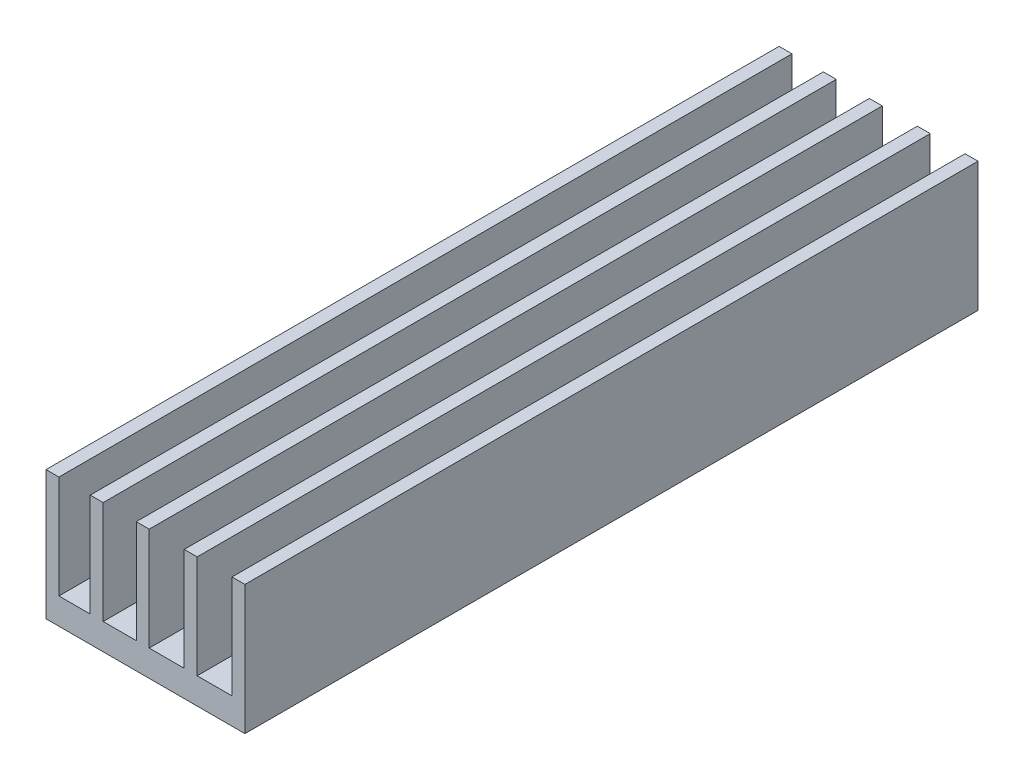
ISO-10303-21;
HEADER;
FILE_DESCRIPTION(('STEP AP214'),'2;1');
FILE_NAME('part.step','',(''),(''),'','','');
FILE_SCHEMA(('AUTOMOTIVE_DESIGN { 1 0 10303 214 1 1 1 1 }'));
ENDSEC;
DATA;
#1=APPLICATION_CONTEXT('core data for automotive mechanical design processes');
#2=APPLICATION_PROTOCOL_DEFINITION('international standard','automotive_design',2000,#1);
#3=PRODUCT_CONTEXT('',#1,'mechanical');
#4=PRODUCT('Part','Part','',(#3));
#5=PRODUCT_RELATED_PRODUCT_CATEGORY('part','',(#4));
#6=PRODUCT_DEFINITION_FORMATION('','',#4);
#7=PRODUCT_DEFINITION_CONTEXT('part definition',#1,'design');
#8=PRODUCT_DEFINITION('design','',#6,#7);
#9=PRODUCT_DEFINITION_SHAPE('','',#8);
#10=(LENGTH_UNIT() NAMED_UNIT(*) SI_UNIT(.MILLI.,.METRE.));
#11=(NAMED_UNIT(*) PLANE_ANGLE_UNIT() SI_UNIT($,.RADIAN.));
#12=(NAMED_UNIT(*) SI_UNIT($,.STERADIAN.) SOLID_ANGLE_UNIT());
#13=UNCERTAINTY_MEASURE_WITH_UNIT(LENGTH_MEASURE(1.E-05),#10,'distance_accuracy_value','');
#14=(GEOMETRIC_REPRESENTATION_CONTEXT(3) GLOBAL_UNCERTAINTY_ASSIGNED_CONTEXT((#13)) GLOBAL_UNIT_ASSIGNED_CONTEXT((#10,
#11,#12)) REPRESENTATION_CONTEXT('',''));
#15=CARTESIAN_POINT('',(0.,0.,0.));
#16=DIRECTION('',(0.,0.,1.));
#17=DIRECTION('',(1.,0.,0.));
#18=AXIS2_PLACEMENT_3D('',#15,#16,#17);
#19=CARTESIAN_POINT('',(0.,0.,-92.202));
#20=DIRECTION('',(-1.,0.,0.));
#21=DIRECTION('',(0.,0.,1.));
#22=AXIS2_PLACEMENT_3D('',#19,#20,#21);
#23=PLANE('',#22);
#24=DIRECTION('',(0.,-1.,0.));
#25=VECTOR('',#24,1.);
#26=CARTESIAN_POINT('',(0.,0.,0.));
#27=LINE('',#26,#25);
#28=CARTESIAN_POINT('',(0.,16.256,0.));
#29=VERTEX_POINT('',#28);
#30=CARTESIAN_POINT('',(0.,0.,0.));
#31=VERTEX_POINT('',#30);
#32=EDGE_CURVE('E170',#29,#31,#27,.T.);
#33=ORIENTED_EDGE('',*,*,#32,.F.);
#34=DIRECTION('',(0.,0.,1.));
#35=VECTOR('',#34,1.);
#36=CARTESIAN_POINT('',(0.,16.256,-92.202));
#37=LINE('',#36,#35);
#38=CARTESIAN_POINT('',(0.,16.256,-92.202));
#39=VERTEX_POINT('',#38);
#40=EDGE_CURVE('E11',#39,#29,#37,.T.);
#41=ORIENTED_EDGE('',*,*,#40,.F.);
#42=DIRECTION('',(0.,-1.,0.));
#43=VECTOR('',#42,1.);
#44=CARTESIAN_POINT('',(0.,0.,-92.202));
#45=LINE('',#44,#43);
#46=CARTESIAN_POINT('',(0.,0.,-92.202));
#47=VERTEX_POINT('',#46);
#48=EDGE_CURVE('E172',#39,#47,#45,.T.);
#49=ORIENTED_EDGE('',*,*,#48,.T.);
#50=DIRECTION('',(0.,0.,1.));
#51=VECTOR('',#50,1.);
#52=CARTESIAN_POINT('',(0.,0.,-92.202));
#53=LINE('',#52,#51);
#54=EDGE_CURVE('E37',#47,#31,#53,.T.);
#55=ORIENTED_EDGE('',*,*,#54,.T.);
#56=EDGE_LOOP('',(#33,#41,#49,#55));
#57=FACE_BOUND('',#56,.T.);
#58=ADVANCED_FACE('F34',(#57),#23,.T.);
#59=CARTESIAN_POINT('',(0.,16.256,-92.202));
#60=DIRECTION('',(0.,1.,0.));
#61=DIRECTION('',(0.,0.,1.));
#62=AXIS2_PLACEMENT_3D('',#59,#60,#61);
#63=PLANE('',#62);
#64=DIRECTION('',(-1.,0.,0.));
#65=VECTOR('',#64,1.);
#66=CARTESIAN_POINT('',(0.,16.256,0.));
#67=LINE('',#66,#65);
#68=CARTESIAN_POINT('',(1.6256,16.256,0.));
#69=VERTEX_POINT('',#68);
#70=EDGE_CURVE('E188',#69,#29,#67,.T.);
#71=ORIENTED_EDGE('',*,*,#70,.F.);
#72=DIRECTION('',(0.,0.,1.));
#73=VECTOR('',#72,1.);
#74=CARTESIAN_POINT('',(1.6256,16.256,-92.202));
#75=LINE('',#74,#73);
#76=CARTESIAN_POINT('',(1.6256,16.256,-92.202));
#77=VERTEX_POINT('',#76);
#78=EDGE_CURVE('E42',#77,#69,#75,.T.);
#79=ORIENTED_EDGE('',*,*,#78,.F.);
#80=DIRECTION('',(-1.,0.,0.));
#81=VECTOR('',#80,1.);
#82=CARTESIAN_POINT('',(0.,16.256,-92.202));
#83=LINE('',#82,#81);
#84=EDGE_CURVE('E177',#77,#39,#83,.T.);
#85=ORIENTED_EDGE('',*,*,#84,.T.);
#86=ORIENTED_EDGE('',*,*,#40,.T.);
#87=EDGE_LOOP('',(#71,#79,#85,#86));
#88=FACE_BOUND('',#87,.T.);
#89=ADVANCED_FACE('F398',(#88),#63,.T.);
#90=CARTESIAN_POINT('',(1.6256,16.256,-92.202));
#91=DIRECTION('',(1.,0.,0.));
#92=DIRECTION('',(0.,1.,0.));
#93=AXIS2_PLACEMENT_3D('',#90,#91,#92);
#94=PLANE('',#93);
#95=DIRECTION('',(0.,1.,0.));
#96=VECTOR('',#95,1.);
#97=CARTESIAN_POINT('',(1.6256,16.256,0.));
#98=LINE('',#97,#96);
#99=CARTESIAN_POINT('',(1.6256,3.302,0.));
#100=VERTEX_POINT('',#99);
#101=EDGE_CURVE('E242',#100,#69,#98,.T.);
#102=ORIENTED_EDGE('',*,*,#101,.F.);
#103=DIRECTION('',(0.,0.,1.));
#104=VECTOR('',#103,1.);
#105=CARTESIAN_POINT('',(1.6256,3.302,-92.202));
#106=LINE('',#105,#104);
#107=CARTESIAN_POINT('',(1.6256,3.302,-92.202));
#108=VERTEX_POINT('',#107);
#109=EDGE_CURVE('E300',#108,#100,#106,.T.);
#110=ORIENTED_EDGE('',*,*,#109,.F.);
#111=DIRECTION('',(0.,1.,0.));
#112=VECTOR('',#111,1.);
#113=CARTESIAN_POINT('',(1.6256,16.256,-92.202));
#114=LINE('',#113,#112);
#115=EDGE_CURVE('E296',#108,#77,#114,.T.);
#116=ORIENTED_EDGE('',*,*,#115,.T.);
#117=ORIENTED_EDGE('',*,*,#78,.T.);
#118=EDGE_LOOP('',(#102,#110,#116,#117));
#119=FACE_BOUND('',#118,.T.);
#120=ADVANCED_FACE('F397',(#119),#94,.T.);
#121=CARTESIAN_POINT('',(1.6256,3.302,-92.202));
#122=DIRECTION('',(0.,1.,0.));
#123=DIRECTION('',(-1.,0.,0.));
#124=AXIS2_PLACEMENT_3D('',#121,#122,#123);
#125=PLANE('',#124);
#126=DIRECTION('',(-1.,0.,0.));
#127=VECTOR('',#126,1.);
#128=CARTESIAN_POINT('',(1.6256,3.302,0.));
#129=LINE('',#128,#127);
#130=CARTESIAN_POINT('',(5.56468810262949,3.302,0.));
#131=VERTEX_POINT('',#130);
#132=EDGE_CURVE('E239',#131,#100,#129,.T.);
#133=ORIENTED_EDGE('',*,*,#132,.F.);
#134=DIRECTION('',(0.,0.,1.));
#135=VECTOR('',#134,1.);
#136=CARTESIAN_POINT('',(5.56468810262949,3.302,-92.202));
#137=LINE('',#136,#135);
#138=CARTESIAN_POINT('',(5.56468810262949,3.302,-92.202));
#139=VERTEX_POINT('',#138);
#140=EDGE_CURVE('E302',#139,#131,#137,.T.);
#141=ORIENTED_EDGE('',*,*,#140,.F.);
#142=DIRECTION('',(-1.,0.,0.));
#143=VECTOR('',#142,1.);
#144=CARTESIAN_POINT('',(1.6256,3.302,-92.202));
#145=LINE('',#144,#143);
#146=EDGE_CURVE('E293',#139,#108,#145,.T.);
#147=ORIENTED_EDGE('',*,*,#146,.T.);
#148=ORIENTED_EDGE('',*,*,#109,.T.);
#149=EDGE_LOOP('',(#133,#141,#147,#148));
#150=FACE_BOUND('',#149,.T.);
#151=ADVANCED_FACE('F393',(#150),#125,.T.);
#152=CARTESIAN_POINT('',(5.56468810262949,3.302,-92.202));
#153=DIRECTION('',(-1.,0.,0.));
#154=DIRECTION('',(0.,-1.,0.));
#155=AXIS2_PLACEMENT_3D('',#152,#153,#154);
#156=PLANE('',#155);
#157=DIRECTION('',(0.,-1.,0.));
#158=VECTOR('',#157,1.);
#159=CARTESIAN_POINT('',(5.56468810262949,3.302,0.));
#160=LINE('',#159,#158);
#161=CARTESIAN_POINT('',(5.56468810262949,16.256,0.));
#162=VERTEX_POINT('',#161);
#163=EDGE_CURVE('E236',#162,#131,#160,.T.);
#164=ORIENTED_EDGE('',*,*,#163,.F.);
#165=DIRECTION('',(0.,0.,1.));
#166=VECTOR('',#165,1.);
#167=CARTESIAN_POINT('',(5.56468810262949,16.256,-92.202));
#168=LINE('',#167,#166);
#169=CARTESIAN_POINT('',(5.56468810262949,16.256,-92.202));
#170=VERTEX_POINT('',#169);
#171=EDGE_CURVE('E304',#170,#162,#168,.T.);
#172=ORIENTED_EDGE('',*,*,#171,.F.);
#173=DIRECTION('',(0.,-1.,0.));
#174=VECTOR('',#173,1.);
#175=CARTESIAN_POINT('',(5.56468810262949,3.302,-92.202));
#176=LINE('',#175,#174);
#177=EDGE_CURVE('E290',#170,#139,#176,.T.);
#178=ORIENTED_EDGE('',*,*,#177,.T.);
#179=ORIENTED_EDGE('',*,*,#140,.T.);
#180=EDGE_LOOP('',(#164,#172,#178,#179));
#181=FACE_BOUND('',#180,.T.);
#182=ADVANCED_FACE('F389',(#181),#156,.T.);
#183=CARTESIAN_POINT('',(5.56468810262949,16.256,-92.202));
#184=DIRECTION('',(0.,1.,0.));
#185=DIRECTION('',(0.,0.,1.));
#186=AXIS2_PLACEMENT_3D('',#183,#184,#185);
#187=PLANE('',#186);
#188=DIRECTION('',(-1.,0.,0.));
#189=VECTOR('',#188,1.);
#190=CARTESIAN_POINT('',(5.56468810262949,16.256,0.));
#191=LINE('',#190,#189);
#192=CARTESIAN_POINT('',(7.19028810262949,16.256,0.));
#193=VERTEX_POINT('',#192);
#194=EDGE_CURVE('E233',#193,#162,#191,.T.);
#195=ORIENTED_EDGE('',*,*,#194,.F.);
#196=DIRECTION('',(0.,0.,1.));
#197=VECTOR('',#196,1.);
#198=CARTESIAN_POINT('',(7.19028810262949,16.256,-92.202));
#199=LINE('',#198,#197);
#200=CARTESIAN_POINT('',(7.19028810262949,16.256,-92.202));
#201=VERTEX_POINT('',#200);
#202=EDGE_CURVE('E306',#201,#193,#199,.T.);
#203=ORIENTED_EDGE('',*,*,#202,.F.);
#204=DIRECTION('',(-1.,0.,0.));
#205=VECTOR('',#204,1.);
#206=CARTESIAN_POINT('',(5.56468810262949,16.256,-92.202));
#207=LINE('',#206,#205);
#208=EDGE_CURVE('E287',#201,#170,#207,.T.);
#209=ORIENTED_EDGE('',*,*,#208,.T.);
#210=ORIENTED_EDGE('',*,*,#171,.T.);
#211=EDGE_LOOP('',(#195,#203,#209,#210));
#212=FACE_BOUND('',#211,.T.);
#213=ADVANCED_FACE('F385',(#212),#187,.T.);
#214=CARTESIAN_POINT('',(7.19028810262949,16.256,-92.202));
#215=DIRECTION('',(1.,0.,0.));
#216=DIRECTION('',(0.,1.,0.));
#217=AXIS2_PLACEMENT_3D('',#214,#215,#216);
#218=PLANE('',#217);
#219=DIRECTION('',(0.,1.,0.));
#220=VECTOR('',#219,1.);
#221=CARTESIAN_POINT('',(7.19028810262949,16.256,0.));
#222=LINE('',#221,#220);
#223=CARTESIAN_POINT('',(7.19028810262949,3.302,0.));
#224=VERTEX_POINT('',#223);
#225=EDGE_CURVE('E230',#224,#193,#222,.T.);
#226=ORIENTED_EDGE('',*,*,#225,.F.);
#227=DIRECTION('',(0.,0.,1.));
#228=VECTOR('',#227,1.);
#229=CARTESIAN_POINT('',(7.19028810262949,3.302,-92.202));
#230=LINE('',#229,#228);
#231=CARTESIAN_POINT('',(7.19028810262949,3.302,-92.202));
#232=VERTEX_POINT('',#231);
#233=EDGE_CURVE('E308',#232,#224,#230,.T.);
#234=ORIENTED_EDGE('',*,*,#233,.F.);
#235=DIRECTION('',(0.,1.,0.));
#236=VECTOR('',#235,1.);
#237=CARTESIAN_POINT('',(7.19028810262949,16.256,-92.202));
#238=LINE('',#237,#236);
#239=EDGE_CURVE('E284',#232,#201,#238,.T.);
#240=ORIENTED_EDGE('',*,*,#239,.T.);
#241=ORIENTED_EDGE('',*,*,#202,.T.);
#242=EDGE_LOOP('',(#226,#234,#240,#241));
#243=FACE_BOUND('',#242,.T.);
#244=ADVANCED_FACE('F381',(#243),#218,.T.);
#245=CARTESIAN_POINT('',(7.19028810262949,3.302,-92.202));
#246=DIRECTION('',(0.,1.,0.));
#247=DIRECTION('',(-1.,0.,0.));
#248=AXIS2_PLACEMENT_3D('',#245,#246,#247);
#249=PLANE('',#248);
#250=CARTESIAN_POINT('',(9.52500000000001,3.302,-25.4));
#251=DIRECTION('',(0.,1.,0.));
#252=DIRECTION('',(-1.,0.,0.));
#253=AXIS2_PLACEMENT_3D('',#250,#251,#252);
#254=CIRCLE('',#253,1.1303);
#255=CARTESIAN_POINT('',(8.39470000000001,3.302,-25.4));
#256=VERTEX_POINT('',#255);
#257=EDGE_CURVE('E504',#256,#256,#254,.T.);
#258=ORIENTED_EDGE('',*,*,#257,.F.);
#259=EDGE_LOOP('',(#258));
#260=FACE_BOUND('',#259,.T.);
#261=CARTESIAN_POINT('',(9.52500000000001,3.302,-78.74));
#262=DIRECTION('',(0.,1.,0.));
#263=DIRECTION('',(-1.,0.,0.));
#264=AXIS2_PLACEMENT_3D('',#261,#262,#263);
#265=CIRCLE('',#264,1.1303);
#266=CARTESIAN_POINT('',(8.39470000000001,3.302,-78.74));
#267=VERTEX_POINT('',#266);
#268=EDGE_CURVE('E189',#267,#267,#265,.T.);
#269=ORIENTED_EDGE('',*,*,#268,.F.);
#270=EDGE_LOOP('',(#269));
#271=FACE_BOUND('',#270,.T.);
#272=DIRECTION('',(-1.,0.,0.));
#273=VECTOR('',#272,1.);
#274=CARTESIAN_POINT('',(7.19028810262949,3.302,0.));
#275=LINE('',#274,#273);
#276=CARTESIAN_POINT('',(11.3520313504382,3.302,0.));
#277=VERTEX_POINT('',#276);
#278=EDGE_CURVE('E227',#277,#224,#275,.T.);
#279=ORIENTED_EDGE('',*,*,#278,.F.);
#280=DIRECTION('',(0.,0.,1.));
#281=VECTOR('',#280,1.);
#282=CARTESIAN_POINT('',(11.3520313504382,3.302,-92.202));
#283=LINE('',#282,#281);
#284=CARTESIAN_POINT('',(11.3520313504382,3.302,-92.202));
#285=VERTEX_POINT('',#284);
#286=EDGE_CURVE('E310',#285,#277,#283,.T.);
#287=ORIENTED_EDGE('',*,*,#286,.F.);
#288=DIRECTION('',(-1.,0.,0.));
#289=VECTOR('',#288,1.);
#290=CARTESIAN_POINT('',(7.19028810262949,3.302,-92.202));
#291=LINE('',#290,#289);
#292=EDGE_CURVE('E281',#285,#232,#291,.T.);
#293=ORIENTED_EDGE('',*,*,#292,.T.);
#294=ORIENTED_EDGE('',*,*,#233,.T.);
#295=EDGE_LOOP('',(#279,#287,#293,#294));
#296=FACE_BOUND('',#295,.T.);
#297=ADVANCED_FACE('F377',(#260,#271,#296),#249,.T.);
#298=CARTESIAN_POINT('',(11.3520313504382,3.302,-92.202));
#299=DIRECTION('',(-1.,0.,0.));
#300=DIRECTION('',(0.,0.,1.));
#301=AXIS2_PLACEMENT_3D('',#298,#299,#300);
#302=PLANE('',#301);
#303=DIRECTION('',(0.,-1.,0.));
#304=VECTOR('',#303,1.);
#305=CARTESIAN_POINT('',(11.3520313504382,3.302,0.));
#306=LINE('',#305,#304);
#307=CARTESIAN_POINT('',(11.3520313504382,16.256,0.));
#308=VERTEX_POINT('',#307);
#309=EDGE_CURVE('E224',#308,#277,#306,.T.);
#310=ORIENTED_EDGE('',*,*,#309,.F.);
#311=DIRECTION('',(0.,0.,1.));
#312=VECTOR('',#311,1.);
#313=CARTESIAN_POINT('',(11.3520313504382,16.256,-92.202));
#314=LINE('',#313,#312);
#315=CARTESIAN_POINT('',(11.3520313504382,16.256,-92.202));
#316=VERTEX_POINT('',#315);
#317=EDGE_CURVE('E312',#316,#308,#314,.T.);
#318=ORIENTED_EDGE('',*,*,#317,.F.);
#319=DIRECTION('',(0.,-1.,0.));
#320=VECTOR('',#319,1.);
#321=CARTESIAN_POINT('',(11.3520313504382,3.302,-92.202));
#322=LINE('',#321,#320);
#323=EDGE_CURVE('E278',#316,#285,#322,.T.);
#324=ORIENTED_EDGE('',*,*,#323,.T.);
#325=ORIENTED_EDGE('',*,*,#286,.T.);
#326=EDGE_LOOP('',(#310,#318,#324,#325));
#327=FACE_BOUND('',#326,.T.);
#328=ADVANCED_FACE('F373',(#327),#302,.T.);
#329=CARTESIAN_POINT('',(11.3520313504382,16.256,-92.202));
#330=DIRECTION('',(0.,1.,0.));
#331=DIRECTION('',(0.,0.,1.));
#332=AXIS2_PLACEMENT_3D('',#329,#330,#331);
#333=PLANE('',#332);
#334=DIRECTION('',(-1.,0.,0.));
#335=VECTOR('',#334,1.);
#336=CARTESIAN_POINT('',(11.3520313504382,16.256,0.));
#337=LINE('',#336,#335);
#338=CARTESIAN_POINT('',(12.9776313504382,16.256,0.));
#339=VERTEX_POINT('',#338);
#340=EDGE_CURVE('E221',#339,#308,#337,.T.);
#341=ORIENTED_EDGE('',*,*,#340,.F.);
#342=DIRECTION('',(0.,0.,1.));
#343=VECTOR('',#342,1.);
#344=CARTESIAN_POINT('',(12.9776313504382,16.256,-92.202));
#345=LINE('',#344,#343);
#346=CARTESIAN_POINT('',(12.9776313504382,16.256,-92.202));
#347=VERTEX_POINT('',#346);
#348=EDGE_CURVE('E314',#347,#339,#345,.T.);
#349=ORIENTED_EDGE('',*,*,#348,.F.);
#350=DIRECTION('',(-1.,0.,0.));
#351=VECTOR('',#350,1.);
#352=CARTESIAN_POINT('',(11.3520313504382,16.256,-92.202));
#353=LINE('',#352,#351);
#354=EDGE_CURVE('E275',#347,#316,#353,.T.);
#355=ORIENTED_EDGE('',*,*,#354,.T.);
#356=ORIENTED_EDGE('',*,*,#317,.T.);
#357=EDGE_LOOP('',(#341,#349,#355,#356));
#358=FACE_BOUND('',#357,.T.);
#359=ADVANCED_FACE('F369',(#358),#333,.T.);
#360=CARTESIAN_POINT('',(12.9776313504382,16.256,-92.202));
#361=DIRECTION('',(1.,0.,0.));
#362=DIRECTION('',(0.,1.,0.));
#363=AXIS2_PLACEMENT_3D('',#360,#361,#362);
#364=PLANE('',#363);
#365=DIRECTION('',(0.,1.,0.));
#366=VECTOR('',#365,1.);
#367=CARTESIAN_POINT('',(12.9776313504382,16.256,0.));
#368=LINE('',#367,#366);
#369=CARTESIAN_POINT('',(12.9776313504382,3.302,0.));
#370=VERTEX_POINT('',#369);
#371=EDGE_CURVE('E218',#370,#339,#368,.T.);
#372=ORIENTED_EDGE('',*,*,#371,.F.);
#373=DIRECTION('',(0.,0.,1.));
#374=VECTOR('',#373,1.);
#375=CARTESIAN_POINT('',(12.9776313504382,3.302,-92.202));
#376=LINE('',#375,#374);
#377=CARTESIAN_POINT('',(12.9776313504382,3.302,-92.202));
#378=VERTEX_POINT('',#377);
#379=EDGE_CURVE('E316',#378,#370,#376,.T.);
#380=ORIENTED_EDGE('',*,*,#379,.F.);
#381=DIRECTION('',(0.,1.,0.));
#382=VECTOR('',#381,1.);
#383=CARTESIAN_POINT('',(12.9776313504382,16.256,-92.202));
#384=LINE('',#383,#382);
#385=EDGE_CURVE('E272',#378,#347,#384,.T.);
#386=ORIENTED_EDGE('',*,*,#385,.T.);
#387=ORIENTED_EDGE('',*,*,#348,.T.);
#388=EDGE_LOOP('',(#372,#380,#386,#387));
#389=FACE_BOUND('',#388,.T.);
#390=ADVANCED_FACE('F365',(#389),#364,.T.);
#391=CARTESIAN_POINT('',(12.9776313504382,3.302,-92.202));
#392=DIRECTION('',(0.,1.,0.));
#393=DIRECTION('',(-1.,0.,0.));
#394=AXIS2_PLACEMENT_3D('',#391,#392,#393);
#395=PLANE('',#394);
#396=DIRECTION('',(-1.,0.,0.));
#397=VECTOR('',#396,1.);
#398=CARTESIAN_POINT('',(12.9776313504382,3.302,0.));
#399=LINE('',#398,#397);
#400=CARTESIAN_POINT('',(17.3874035945817,3.302,0.));
#401=VERTEX_POINT('',#400);
#402=EDGE_CURVE('E215',#401,#370,#399,.T.);
#403=ORIENTED_EDGE('',*,*,#402,.F.);
#404=DIRECTION('',(0.,0.,1.));
#405=VECTOR('',#404,1.);
#406=CARTESIAN_POINT('',(17.3874035945817,3.302,-92.202));
#407=LINE('',#406,#405);
#408=CARTESIAN_POINT('',(17.3874035945817,3.302,-92.202));
#409=VERTEX_POINT('',#408);
#410=EDGE_CURVE('E318',#409,#401,#407,.T.);
#411=ORIENTED_EDGE('',*,*,#410,.F.);
#412=DIRECTION('',(-1.,0.,0.));
#413=VECTOR('',#412,1.);
#414=CARTESIAN_POINT('',(12.9776313504382,3.302,-92.202));
#415=LINE('',#414,#413);
#416=EDGE_CURVE('E269',#409,#378,#415,.T.);
#417=ORIENTED_EDGE('',*,*,#416,.T.);
#418=ORIENTED_EDGE('',*,*,#379,.T.);
#419=EDGE_LOOP('',(#403,#411,#417,#418));
#420=FACE_BOUND('',#419,.T.);
#421=ADVANCED_FACE('F361',(#420),#395,.T.);
#422=CARTESIAN_POINT('',(17.3874035945817,3.302,-92.202));
#423=DIRECTION('',(-1.,0.,0.));
#424=DIRECTION('',(0.,0.,1.));
#425=AXIS2_PLACEMENT_3D('',#422,#423,#424);
#426=PLANE('',#425);
#427=DIRECTION('',(0.,-1.,0.));
#428=VECTOR('',#427,1.);
#429=CARTESIAN_POINT('',(17.3874035945817,3.302,0.));
#430=LINE('',#429,#428);
#431=CARTESIAN_POINT('',(17.3874035945817,16.256,0.));
#432=VERTEX_POINT('',#431);
#433=EDGE_CURVE('E212',#432,#401,#430,.T.);
#434=ORIENTED_EDGE('',*,*,#433,.F.);
#435=DIRECTION('',(0.,0.,1.));
#436=VECTOR('',#435,1.);
#437=CARTESIAN_POINT('',(17.3874035945817,16.256,-92.202));
#438=LINE('',#437,#436);
#439=CARTESIAN_POINT('',(17.3874035945817,16.256,-92.202));
#440=VERTEX_POINT('',#439);
#441=EDGE_CURVE('E320',#440,#432,#438,.T.);
#442=ORIENTED_EDGE('',*,*,#441,.F.);
#443=DIRECTION('',(0.,-1.,0.));
#444=VECTOR('',#443,1.);
#445=CARTESIAN_POINT('',(17.3874035945817,3.302,-92.202));
#446=LINE('',#445,#444);
#447=EDGE_CURVE('E266',#440,#409,#446,.T.);
#448=ORIENTED_EDGE('',*,*,#447,.T.);
#449=ORIENTED_EDGE('',*,*,#410,.T.);
#450=EDGE_LOOP('',(#434,#442,#448,#449));
#451=FACE_BOUND('',#450,.T.);
#452=ADVANCED_FACE('F357',(#451),#426,.T.);
#453=CARTESIAN_POINT('',(17.3874035945817,16.256,-92.202));
#454=DIRECTION('',(0.,1.,0.));
#455=DIRECTION('',(0.,0.,1.));
#456=AXIS2_PLACEMENT_3D('',#453,#454,#455);
#457=PLANE('',#456);
#458=DIRECTION('',(-1.,0.,0.));
#459=VECTOR('',#458,1.);
#460=CARTESIAN_POINT('',(17.3874035945817,16.256,0.));
#461=LINE('',#460,#459);
#462=CARTESIAN_POINT('',(19.0130035945817,16.256,0.));
#463=VERTEX_POINT('',#462);
#464=EDGE_CURVE('E209',#463,#432,#461,.T.);
#465=ORIENTED_EDGE('',*,*,#464,.F.);
#466=DIRECTION('',(0.,0.,1.));
#467=VECTOR('',#466,1.);
#468=CARTESIAN_POINT('',(19.0130035945817,16.256,-92.202));
#469=LINE('',#468,#467);
#470=CARTESIAN_POINT('',(19.0130035945817,16.256,-92.202));
#471=VERTEX_POINT('',#470);
#472=EDGE_CURVE('E322',#471,#463,#469,.T.);
#473=ORIENTED_EDGE('',*,*,#472,.F.);
#474=DIRECTION('',(-1.,0.,0.));
#475=VECTOR('',#474,1.);
#476=CARTESIAN_POINT('',(17.3874035945817,16.256,-92.202));
#477=LINE('',#476,#475);
#478=EDGE_CURVE('E263',#471,#440,#477,.T.);
#479=ORIENTED_EDGE('',*,*,#478,.T.);
#480=ORIENTED_EDGE('',*,*,#441,.T.);
#481=EDGE_LOOP('',(#465,#473,#479,#480));
#482=FACE_BOUND('',#481,.T.);
#483=ADVANCED_FACE('F353',(#482),#457,.T.);
#484=CARTESIAN_POINT('',(19.0130035945817,16.256,-92.202));
#485=DIRECTION('',(1.,0.,0.));
#486=DIRECTION('',(0.,0.,-1.));
#487=AXIS2_PLACEMENT_3D('',#484,#485,#486);
#488=PLANE('',#487);
#489=DIRECTION('',(0.,1.,0.));
#490=VECTOR('',#489,1.);
#491=CARTESIAN_POINT('',(19.0130035945817,16.256,0.));
#492=LINE('',#491,#490);
#493=CARTESIAN_POINT('',(19.0130035945817,3.302,0.));
#494=VERTEX_POINT('',#493);
#495=EDGE_CURVE('E206',#494,#463,#492,.T.);
#496=ORIENTED_EDGE('',*,*,#495,.F.);
#497=DIRECTION('',(0.,0.,1.));
#498=VECTOR('',#497,1.);
#499=CARTESIAN_POINT('',(19.0130035945817,3.302,-92.202));
#500=LINE('',#499,#498);
#501=CARTESIAN_POINT('',(19.0130035945817,3.302,-92.202));
#502=VERTEX_POINT('',#501);
#503=EDGE_CURVE('E324',#502,#494,#500,.T.);
#504=ORIENTED_EDGE('',*,*,#503,.F.);
#505=DIRECTION('',(0.,1.,0.));
#506=VECTOR('',#505,1.);
#507=CARTESIAN_POINT('',(19.0130035945817,16.256,-92.202));
#508=LINE('',#507,#506);
#509=EDGE_CURVE('E260',#502,#471,#508,.T.);
#510=ORIENTED_EDGE('',*,*,#509,.T.);
#511=ORIENTED_EDGE('',*,*,#472,.T.);
#512=EDGE_LOOP('',(#496,#504,#510,#511));
#513=FACE_BOUND('',#512,.T.);
#514=ADVANCED_FACE('F349',(#513),#488,.T.);
#515=CARTESIAN_POINT('',(19.0130035945817,3.302,-92.202));
#516=DIRECTION('',(0.,1.,0.));
#517=DIRECTION('',(-1.,0.,0.));
#518=AXIS2_PLACEMENT_3D('',#515,#516,#517);
#519=PLANE('',#518);
#520=DIRECTION('',(-1.,0.,0.));
#521=VECTOR('',#520,1.);
#522=CARTESIAN_POINT('',(19.0130035945817,3.302,0.));
#523=LINE('',#522,#521);
#524=CARTESIAN_POINT('',(23.3934,3.302,0.));
#525=VERTEX_POINT('',#524);
#526=EDGE_CURVE('E203',#525,#494,#523,.T.);
#527=ORIENTED_EDGE('',*,*,#526,.F.);
#528=DIRECTION('',(0.,0.,1.));
#529=VECTOR('',#528,1.);
#530=CARTESIAN_POINT('',(23.3934,3.302,-92.202));
#531=LINE('',#530,#529);
#532=CARTESIAN_POINT('',(23.3934,3.302,-92.202));
#533=VERTEX_POINT('',#532);
#534=EDGE_CURVE('E326',#533,#525,#531,.T.);
#535=ORIENTED_EDGE('',*,*,#534,.F.);
#536=DIRECTION('',(-1.,0.,0.));
#537=VECTOR('',#536,1.);
#538=CARTESIAN_POINT('',(19.0130035945817,3.302,-92.202));
#539=LINE('',#538,#537);
#540=EDGE_CURVE('E257',#533,#502,#539,.T.);
#541=ORIENTED_EDGE('',*,*,#540,.T.);
#542=ORIENTED_EDGE('',*,*,#503,.T.);
#543=EDGE_LOOP('',(#527,#535,#541,#542));
#544=FACE_BOUND('',#543,.T.);
#545=ADVANCED_FACE('F345',(#544),#519,.T.);
#546=CARTESIAN_POINT('',(23.3934,3.302,-92.202));
#547=DIRECTION('',(-1.,0.,0.));
#548=DIRECTION('',(0.,0.,1.));
#549=AXIS2_PLACEMENT_3D('',#546,#547,#548);
#550=PLANE('',#549);
#551=DIRECTION('',(0.,-1.,0.));
#552=VECTOR('',#551,1.);
#553=CARTESIAN_POINT('',(23.3934,3.302,0.));
#554=LINE('',#553,#552);
#555=CARTESIAN_POINT('',(23.3934,16.256,0.));
#556=VERTEX_POINT('',#555);
#557=EDGE_CURVE('E200',#556,#525,#554,.T.);
#558=ORIENTED_EDGE('',*,*,#557,.F.);
#559=DIRECTION('',(0.,0.,1.));
#560=VECTOR('',#559,1.);
#561=CARTESIAN_POINT('',(23.3934,16.256,-92.202));
#562=LINE('',#561,#560);
#563=CARTESIAN_POINT('',(23.3934,16.256,-92.202));
#564=VERTEX_POINT('',#563);
#565=EDGE_CURVE('E328',#564,#556,#562,.T.);
#566=ORIENTED_EDGE('',*,*,#565,.F.);
#567=DIRECTION('',(0.,-1.,0.));
#568=VECTOR('',#567,1.);
#569=CARTESIAN_POINT('',(23.3934,3.302,-92.202));
#570=LINE('',#569,#568);
#571=EDGE_CURVE('E254',#564,#533,#570,.T.);
#572=ORIENTED_EDGE('',*,*,#571,.T.);
#573=ORIENTED_EDGE('',*,*,#534,.T.);
#574=EDGE_LOOP('',(#558,#566,#572,#573));
#575=FACE_BOUND('',#574,.T.);
#576=ADVANCED_FACE('F341',(#575),#550,.T.);
#577=CARTESIAN_POINT('',(23.3934,16.256,-92.202));
#578=DIRECTION('',(0.,1.,0.));
#579=DIRECTION('',(0.,0.,1.));
#580=AXIS2_PLACEMENT_3D('',#577,#578,#579);
#581=PLANE('',#580);
#582=DIRECTION('',(-1.,0.,0.));
#583=VECTOR('',#582,1.);
#584=CARTESIAN_POINT('',(23.3934,16.256,0.));
#585=LINE('',#584,#583);
#586=CARTESIAN_POINT('',(25.019,16.256,0.));
#587=VERTEX_POINT('',#586);
#588=EDGE_CURVE('E197',#587,#556,#585,.T.);
#589=ORIENTED_EDGE('',*,*,#588,.F.);
#590=DIRECTION('',(0.,0.,1.));
#591=VECTOR('',#590,1.);
#592=CARTESIAN_POINT('',(25.019,16.256,-92.202));
#593=LINE('',#592,#591);
#594=CARTESIAN_POINT('',(25.019,16.256,-92.202));
#595=VERTEX_POINT('',#594);
#596=EDGE_CURVE('E330',#595,#587,#593,.T.);
#597=ORIENTED_EDGE('',*,*,#596,.F.);
#598=DIRECTION('',(-1.,0.,0.));
#599=VECTOR('',#598,1.);
#600=CARTESIAN_POINT('',(23.3934,16.256,-92.202));
#601=LINE('',#600,#599);
#602=EDGE_CURVE('E251',#595,#564,#601,.T.);
#603=ORIENTED_EDGE('',*,*,#602,.T.);
#604=ORIENTED_EDGE('',*,*,#565,.T.);
#605=EDGE_LOOP('',(#589,#597,#603,#604));
#606=FACE_BOUND('',#605,.T.);
#607=ADVANCED_FACE('F337',(#606),#581,.T.);
#608=CARTESIAN_POINT('',(25.019,16.256,-92.202));
#609=DIRECTION('',(1.,0.,0.));
#610=DIRECTION('',(0.,1.,0.));
#611=AXIS2_PLACEMENT_3D('',#608,#609,#610);
#612=PLANE('',#611);
#613=DIRECTION('',(0.,1.,0.));
#614=VECTOR('',#613,1.);
#615=CARTESIAN_POINT('',(25.019,16.256,0.));
#616=LINE('',#615,#614);
#617=CARTESIAN_POINT('',(25.019,0.,0.));
#618=VERTEX_POINT('',#617);
#619=EDGE_CURVE('E184',#618,#587,#616,.T.);
#620=ORIENTED_EDGE('',*,*,#619,.F.);
#621=DIRECTION('',(0.,0.,1.));
#622=VECTOR('',#621,1.);
#623=CARTESIAN_POINT('',(25.019,0.,-92.202));
#624=LINE('',#623,#622);
#625=CARTESIAN_POINT('',(25.019,0.,-92.202));
#626=VERTEX_POINT('',#625);
#627=EDGE_CURVE('E176',#626,#618,#624,.T.);
#628=ORIENTED_EDGE('',*,*,#627,.F.);
#629=DIRECTION('',(0.,1.,0.));
#630=VECTOR('',#629,1.);
#631=CARTESIAN_POINT('',(25.019,16.256,-92.202));
#632=LINE('',#631,#630);
#633=EDGE_CURVE('E248',#626,#595,#632,.T.);
#634=ORIENTED_EDGE('',*,*,#633,.T.);
#635=ORIENTED_EDGE('',*,*,#596,.T.);
#636=EDGE_LOOP('',(#620,#628,#634,#635));
#637=FACE_BOUND('',#636,.T.);
#638=ADVANCED_FACE('F333',(#637),#612,.T.);
#639=CARTESIAN_POINT('',(0.,0.,-92.202));
#640=DIRECTION('',(0.,-1.,0.));
#641=DIRECTION('',(0.,0.,-1.));
#642=AXIS2_PLACEMENT_3D('',#639,#640,#641);
#643=PLANE('',#642);
#644=CARTESIAN_POINT('',(9.52500000000001,0.,-25.4));
#645=DIRECTION('',(0.,-1.,0.));
#646=DIRECTION('',(0.,0.,-1.));
#647=AXIS2_PLACEMENT_3D('',#644,#645,#646);
#648=CIRCLE('',#647,1.1303);
#649=CARTESIAN_POINT('',(9.52500000000001,0.,-26.5303));
#650=VERTEX_POINT('',#649);
#651=EDGE_CURVE('E507',#650,#650,#648,.T.);
#652=ORIENTED_EDGE('',*,*,#651,.F.);
#653=EDGE_LOOP('',(#652));
#654=FACE_BOUND('',#653,.T.);
#655=CARTESIAN_POINT('',(9.52500000000001,0.,-78.74));
#656=DIRECTION('',(0.,-1.,0.));
#657=DIRECTION('',(0.,0.,-1.));
#658=AXIS2_PLACEMENT_3D('',#655,#656,#657);
#659=CIRCLE('',#658,1.1303);
#660=CARTESIAN_POINT('',(9.52500000000001,0.,-79.8703));
#661=VERTEX_POINT('',#660);
#662=EDGE_CURVE('E192',#661,#661,#659,.T.);
#663=ORIENTED_EDGE('',*,*,#662,.F.);
#664=EDGE_LOOP('',(#663));
#665=FACE_BOUND('',#664,.T.);
#666=DIRECTION('',(1.,0.,0.));
#667=VECTOR('',#666,1.);
#668=CARTESIAN_POINT('',(0.,0.,0.));
#669=LINE('',#668,#667);
#670=EDGE_CURVE('E179',#31,#618,#669,.T.);
#671=ORIENTED_EDGE('',*,*,#670,.F.);
#672=ORIENTED_EDGE('',*,*,#54,.F.);
#673=DIRECTION('',(1.,0.,0.));
#674=VECTOR('',#673,1.);
#675=CARTESIAN_POINT('',(0.,0.,-92.202));
#676=LINE('',#675,#674);
#677=EDGE_CURVE('E246',#47,#626,#676,.T.);
#678=ORIENTED_EDGE('',*,*,#677,.T.);
#679=ORIENTED_EDGE('',*,*,#627,.T.);
#680=EDGE_LOOP('',(#671,#672,#678,#679));
#681=FACE_BOUND('',#680,.T.);
#682=ADVANCED_FACE('F180',(#654,#665,#681),#643,.T.);
#683=CARTESIAN_POINT('',(0.,16.256,-92.202));
#684=DIRECTION('',(0.,0.,-1.));
#685=DIRECTION('',(-1.,0.,0.));
#686=AXIS2_PLACEMENT_3D('',#683,#684,#685);
#687=PLANE('',#686);
#688=ORIENTED_EDGE('',*,*,#48,.F.);
#689=ORIENTED_EDGE('',*,*,#84,.F.);
#690=ORIENTED_EDGE('',*,*,#115,.F.);
#691=ORIENTED_EDGE('',*,*,#146,.F.);
#692=ORIENTED_EDGE('',*,*,#177,.F.);
#693=ORIENTED_EDGE('',*,*,#208,.F.);
#694=ORIENTED_EDGE('',*,*,#239,.F.);
#695=ORIENTED_EDGE('',*,*,#292,.F.);
#696=ORIENTED_EDGE('',*,*,#323,.F.);
#697=ORIENTED_EDGE('',*,*,#354,.F.);
#698=ORIENTED_EDGE('',*,*,#385,.F.);
#699=ORIENTED_EDGE('',*,*,#416,.F.);
#700=ORIENTED_EDGE('',*,*,#447,.F.);
#701=ORIENTED_EDGE('',*,*,#478,.F.);
#702=ORIENTED_EDGE('',*,*,#509,.F.);
#703=ORIENTED_EDGE('',*,*,#540,.F.);
#704=ORIENTED_EDGE('',*,*,#571,.F.);
#705=ORIENTED_EDGE('',*,*,#602,.F.);
#706=ORIENTED_EDGE('',*,*,#633,.F.);
#707=ORIENTED_EDGE('',*,*,#677,.F.);
#708=EDGE_LOOP('',(#688,#689,#690,#691,#692,#693,#694,#695,#696,#697,#698,#699,#700,#701,#702,
#703,#704,#705,#706,#707));
#709=FACE_BOUND('',#708,.T.);
#710=ADVANCED_FACE('F401',(#709),#687,.T.);
#711=CARTESIAN_POINT('',(0.,16.256,0.));
#712=DIRECTION('',(0.,0.,-1.));
#713=DIRECTION('',(-1.,0.,0.));
#714=AXIS2_PLACEMENT_3D('',#711,#712,#713);
#715=PLANE('',#714);
#716=ORIENTED_EDGE('',*,*,#32,.T.);
#717=ORIENTED_EDGE('',*,*,#670,.T.);
#718=ORIENTED_EDGE('',*,*,#619,.T.);
#719=ORIENTED_EDGE('',*,*,#588,.T.);
#720=ORIENTED_EDGE('',*,*,#557,.T.);
#721=ORIENTED_EDGE('',*,*,#526,.T.);
#722=ORIENTED_EDGE('',*,*,#495,.T.);
#723=ORIENTED_EDGE('',*,*,#464,.T.);
#724=ORIENTED_EDGE('',*,*,#433,.T.);
#725=ORIENTED_EDGE('',*,*,#402,.T.);
#726=ORIENTED_EDGE('',*,*,#371,.T.);
#727=ORIENTED_EDGE('',*,*,#340,.T.);
#728=ORIENTED_EDGE('',*,*,#309,.T.);
#729=ORIENTED_EDGE('',*,*,#278,.T.);
#730=ORIENTED_EDGE('',*,*,#225,.T.);
#731=ORIENTED_EDGE('',*,*,#194,.T.);
#732=ORIENTED_EDGE('',*,*,#163,.T.);
#733=ORIENTED_EDGE('',*,*,#132,.T.);
#734=ORIENTED_EDGE('',*,*,#101,.T.);
#735=ORIENTED_EDGE('',*,*,#70,.T.);
#736=EDGE_LOOP('',(#716,#717,#718,#719,#720,#721,#722,#723,#724,#725,#726,#727,#728,#729,#730,
#731,#732,#733,#734,#735));
#737=FACE_BOUND('',#736,.T.);
#738=ADVANCED_FACE('F186',(#737),#715,.F.);
#739=CARTESIAN_POINT('',(9.52500000000001,0.,-78.74));
#740=DIRECTION('',(0.,-1.,0.));
#741=DIRECTION('',(0.,0.,-1.));
#742=AXIS2_PLACEMENT_3D('',#739,#740,#741);
#743=CYLINDRICAL_SURFACE('',#742,1.1303);
#744=ORIENTED_EDGE('',*,*,#268,.T.);
#745=EDGE_LOOP('',(#744));
#746=FACE_BOUND('',#745,.T.);
#747=ORIENTED_EDGE('',*,*,#662,.T.);
#748=EDGE_LOOP('',(#747));
#749=FACE_BOUND('',#748,.T.);
#750=ADVANCED_FACE('F408',(#746,#749),#743,.F.);
#751=CARTESIAN_POINT('',(9.52500000000001,0.,-25.4));
#752=DIRECTION('',(0.,-1.,0.));
#753=DIRECTION('',(0.,0.,-1.));
#754=AXIS2_PLACEMENT_3D('',#751,#752,#753);
#755=CYLINDRICAL_SURFACE('',#754,1.1303);
#756=ORIENTED_EDGE('',*,*,#257,.T.);
#757=EDGE_LOOP('',(#756));
#758=FACE_BOUND('',#757,.T.);
#759=ORIENTED_EDGE('',*,*,#651,.T.);
#760=EDGE_LOOP('',(#759));
#761=FACE_BOUND('',#760,.T.);
#762=ADVANCED_FACE('F476',(#758,#761),#755,.F.);
#763=CLOSED_SHELL('',(#58,#89,#120,#151,#182,#213,#244,#297,#328,#359,#390,#421,#452,#483,#514,
#545,#576,#607,#638,#682,#710,#738,#750,#762));
#764=MANIFOLD_SOLID_BREP('B2',#763);
#765=ADVANCED_BREP_SHAPE_REPRESENTATION('',(#18,#764),#14);
#766=SHAPE_DEFINITION_REPRESENTATION(#9,#765);
ENDSEC;
END-ISO-10303-21;
